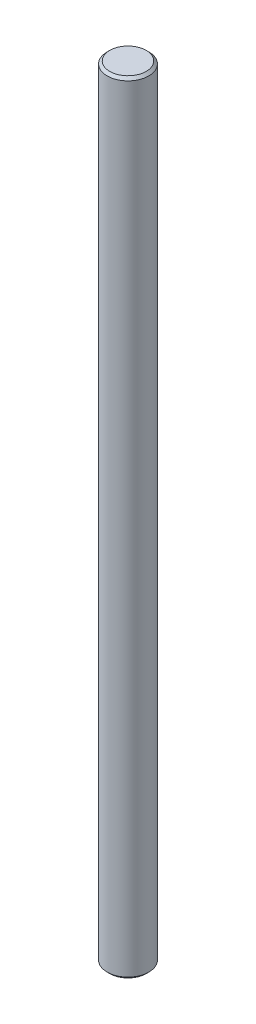
ISO-10303-21;
HEADER;
FILE_DESCRIPTION(('STEP AP214'),'2;1');
FILE_NAME('part.step','',(''),(''),'','','');
FILE_SCHEMA(('AUTOMOTIVE_DESIGN { 1 0 10303 214 1 1 1 1 }'));
ENDSEC;
DATA;
#1=APPLICATION_CONTEXT('core data for automotive mechanical design processes');
#2=APPLICATION_PROTOCOL_DEFINITION('international standard','automotive_design',2000,#1);
#3=PRODUCT_CONTEXT('',#1,'mechanical');
#4=PRODUCT('Part','Part','',(#3));
#5=PRODUCT_RELATED_PRODUCT_CATEGORY('part','',(#4));
#6=PRODUCT_DEFINITION_FORMATION('','',#4);
#7=PRODUCT_DEFINITION_CONTEXT('part definition',#1,'design');
#8=PRODUCT_DEFINITION('design','',#6,#7);
#9=PRODUCT_DEFINITION_SHAPE('','',#8);
#10=(LENGTH_UNIT() NAMED_UNIT(*) SI_UNIT(.MILLI.,.METRE.));
#11=(NAMED_UNIT(*) PLANE_ANGLE_UNIT() SI_UNIT($,.RADIAN.));
#12=(NAMED_UNIT(*) SI_UNIT($,.STERADIAN.) SOLID_ANGLE_UNIT());
#13=UNCERTAINTY_MEASURE_WITH_UNIT(LENGTH_MEASURE(1.E-05),#10,'distance_accuracy_value','');
#14=(GEOMETRIC_REPRESENTATION_CONTEXT(3) GLOBAL_UNCERTAINTY_ASSIGNED_CONTEXT((#13)) GLOBAL_UNIT_ASSIGNED_CONTEXT((#10,
#11,#12)) REPRESENTATION_CONTEXT('',''));
#15=CARTESIAN_POINT('',(0.,0.,0.));
#16=DIRECTION('',(0.,0.,1.));
#17=DIRECTION('',(1.,0.,0.));
#18=AXIS2_PLACEMENT_3D('',#15,#16,#17);
#19=CARTESIAN_POINT('',(0.,150.,0.));
#20=DIRECTION('',(0.,-1.,0.));
#21=DIRECTION('',(0.,0.,-1.));
#22=AXIS2_PLACEMENT_3D('',#19,#20,#21);
#23=CYLINDRICAL_SURFACE('',#22,4.);
#24=CARTESIAN_POINT('',(0.,149.5,0.));
#25=DIRECTION('',(0.,1.,0.));
#26=DIRECTION('',(0.,0.,1.));
#27=AXIS2_PLACEMENT_3D('',#24,#25,#26);
#28=CIRCLE('',#27,4.);
#29=CARTESIAN_POINT('',(0.,149.5,4.));
#30=VERTEX_POINT('',#29);
#31=EDGE_CURVE('E40',#30,#30,#28,.F.);
#32=ORIENTED_EDGE('',*,*,#31,.T.);
#33=EDGE_LOOP('',(#32));
#34=FACE_BOUND('',#33,.T.);
#35=CARTESIAN_POINT('',(0.,0.499999999999973,0.));
#36=DIRECTION('',(0.,1.,0.));
#37=DIRECTION('',(0.,0.,1.));
#38=AXIS2_PLACEMENT_3D('',#35,#36,#37);
#39=CIRCLE('',#38,4.);
#40=CARTESIAN_POINT('',(0.,0.499999999999973,4.));
#41=VERTEX_POINT('',#40);
#42=EDGE_CURVE('E44',#41,#41,#39,.T.);
#43=ORIENTED_EDGE('',*,*,#42,.T.);
#44=EDGE_LOOP('',(#43));
#45=FACE_BOUND('',#44,.T.);
#46=ADVANCED_FACE('F33',(#34,#45),#23,.T.);
#47=CARTESIAN_POINT('',(0.,150.,0.));
#48=DIRECTION('',(0.,1.,0.));
#49=DIRECTION('',(0.,0.,1.));
#50=AXIS2_PLACEMENT_3D('',#47,#48,#49);
#51=PLANE('',#50);
#52=CARTESIAN_POINT('',(0.,150.,0.));
#53=DIRECTION('',(0.,1.,0.));
#54=DIRECTION('',(0.,0.,1.));
#55=AXIS2_PLACEMENT_3D('',#52,#53,#54);
#56=CIRCLE('',#55,3.50000000000002);
#57=CARTESIAN_POINT('',(0.,150.,3.50000000000002));
#58=VERTEX_POINT('',#57);
#59=EDGE_CURVE('E48',#58,#58,#56,.T.);
#60=ORIENTED_EDGE('',*,*,#59,.T.);
#61=EDGE_LOOP('',(#60));
#62=FACE_BOUND('',#61,.T.);
#63=ADVANCED_FACE('F54',(#62),#51,.T.);
#64=CARTESIAN_POINT('',(0.,0.,0.));
#65=DIRECTION('',(0.,1.,0.));
#66=DIRECTION('',(0.,0.,1.));
#67=AXIS2_PLACEMENT_3D('',#64,#65,#66);
#68=PLANE('',#67);
#69=CARTESIAN_POINT('',(0.,0.,0.));
#70=DIRECTION('',(0.,1.,0.));
#71=DIRECTION('',(0.,0.,1.));
#72=AXIS2_PLACEMENT_3D('',#69,#70,#71);
#73=CIRCLE('',#72,3.50000000000002);
#74=CARTESIAN_POINT('',(0.,0.,3.50000000000002));
#75=VERTEX_POINT('',#74);
#76=EDGE_CURVE('E10',#75,#75,#73,.F.);
#77=ORIENTED_EDGE('',*,*,#76,.T.);
#78=EDGE_LOOP('',(#77));
#79=FACE_BOUND('',#78,.T.);
#80=ADVANCED_FACE('F58',(#79),#68,.F.);
#81=CARTESIAN_POINT('',(0.,150.,0.));
#82=DIRECTION('',(0.,-1.,0.));
#83=DIRECTION('',(0.,0.,-1.));
#84=AXIS2_PLACEMENT_3D('',#81,#82,#83);
#85=CONICAL_SURFACE('',#84,3.50000000000002,0.785398163397486);
#86=ORIENTED_EDGE('',*,*,#31,.F.);
#87=EDGE_LOOP('',(#86));
#88=FACE_BOUND('',#87,.T.);
#89=ORIENTED_EDGE('',*,*,#59,.F.);
#90=EDGE_LOOP('',(#89));
#91=FACE_BOUND('',#90,.T.);
#92=ADVANCED_FACE('F56',(#88,#91),#85,.T.);
#93=CARTESIAN_POINT('',(0.,0.499999999999973,0.));
#94=DIRECTION('',(0.,1.,0.));
#95=DIRECTION('',(0.,0.,1.));
#96=AXIS2_PLACEMENT_3D('',#93,#94,#95);
#97=CONICAL_SURFACE('',#96,4.,0.785398163397459);
#98=ORIENTED_EDGE('',*,*,#76,.F.);
#99=EDGE_LOOP('',(#98));
#100=FACE_BOUND('',#99,.T.);
#101=ORIENTED_EDGE('',*,*,#42,.F.);
#102=EDGE_LOOP('',(#101));
#103=FACE_BOUND('',#102,.T.);
#104=ADVANCED_FACE('F35',(#100,#103),#97,.T.);
#105=CLOSED_SHELL('',(#46,#63,#80,#92,#104));
#106=MANIFOLD_SOLID_BREP('B2',#105);
#107=ADVANCED_BREP_SHAPE_REPRESENTATION('',(#18,#106),#14);
#108=SHAPE_DEFINITION_REPRESENTATION(#9,#107);
ENDSEC;
END-ISO-10303-21;
